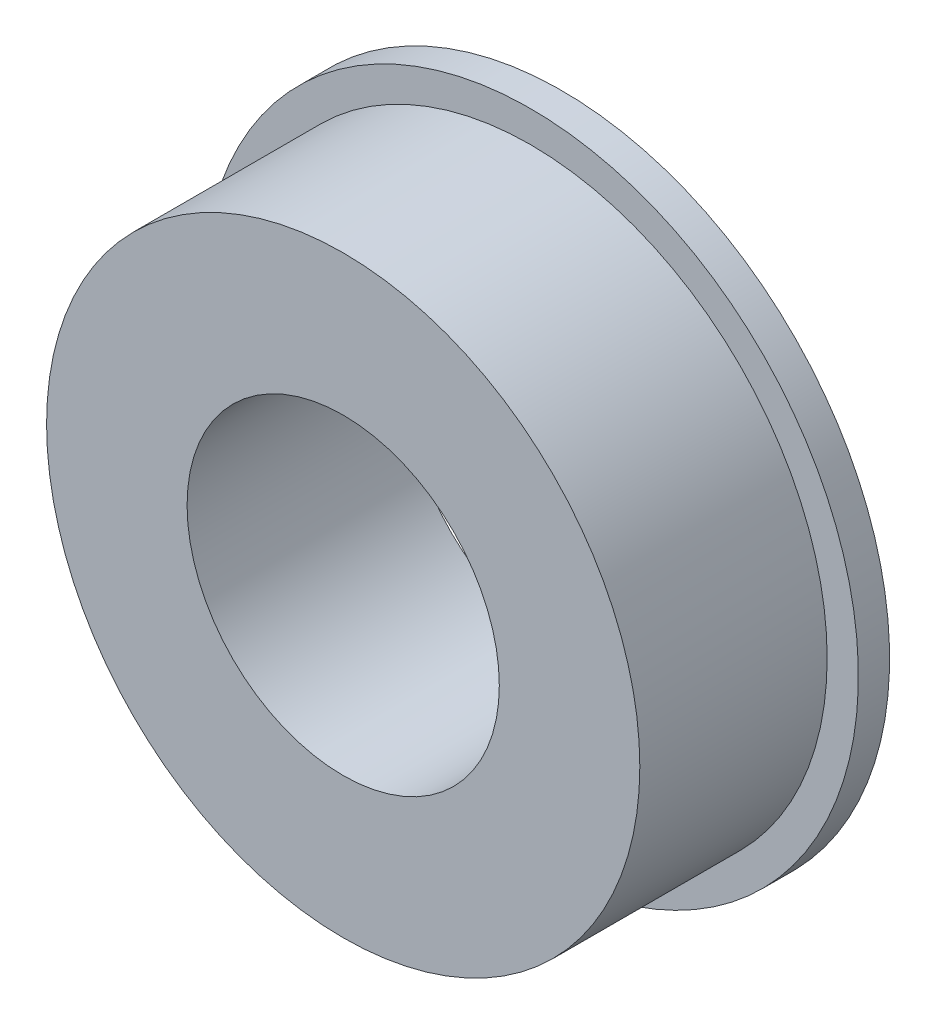
ISO-10303-21;
HEADER;
FILE_DESCRIPTION(('STEP AP214'),'2;1');
FILE_NAME('part.step','',(''),(''),'','','');
FILE_SCHEMA(('AUTOMOTIVE_DESIGN { 1 0 10303 214 1 1 1 1 }'));
ENDSEC;
DATA;
#1=APPLICATION_CONTEXT('core data for automotive mechanical design processes');
#2=APPLICATION_PROTOCOL_DEFINITION('international standard','automotive_design',2000,#1);
#3=PRODUCT_CONTEXT('',#1,'mechanical');
#4=PRODUCT('Part','Part','',(#3));
#5=PRODUCT_RELATED_PRODUCT_CATEGORY('part','',(#4));
#6=PRODUCT_DEFINITION_FORMATION('','',#4);
#7=PRODUCT_DEFINITION_CONTEXT('part definition',#1,'design');
#8=PRODUCT_DEFINITION('design','',#6,#7);
#9=PRODUCT_DEFINITION_SHAPE('','',#8);
#10=(LENGTH_UNIT() NAMED_UNIT(*) SI_UNIT(.MILLI.,.METRE.));
#11=(NAMED_UNIT(*) PLANE_ANGLE_UNIT() SI_UNIT($,.RADIAN.));
#12=(NAMED_UNIT(*) SI_UNIT($,.STERADIAN.) SOLID_ANGLE_UNIT());
#13=UNCERTAINTY_MEASURE_WITH_UNIT(LENGTH_MEASURE(1.E-05),#10,'distance_accuracy_value','');
#14=(GEOMETRIC_REPRESENTATION_CONTEXT(3) GLOBAL_UNCERTAINTY_ASSIGNED_CONTEXT((#13)) GLOBAL_UNIT_ASSIGNED_CONTEXT((#10,
#11,#12)) REPRESENTATION_CONTEXT('',''));
#15=CARTESIAN_POINT('',(0.,0.,0.));
#16=DIRECTION('',(0.,0.,1.));
#17=DIRECTION('',(1.,0.,0.));
#18=AXIS2_PLACEMENT_3D('',#15,#16,#17);
#19=CARTESIAN_POINT('',(0.,0.,6.));
#20=DIRECTION('',(0.,0.,1.));
#21=DIRECTION('',(1.,0.,0.));
#22=AXIS2_PLACEMENT_3D('',#19,#20,#21);
#23=PLANE('',#22);
#24=CARTESIAN_POINT('',(0.,0.,6.));
#25=DIRECTION('',(0.,0.,1.));
#26=DIRECTION('',(1.,0.,0.));
#27=AXIS2_PLACEMENT_3D('',#24,#25,#26);
#28=CIRCLE('',#27,9.5);
#29=CARTESIAN_POINT('',(9.5,0.,6.));
#30=VERTEX_POINT('',#29);
#31=EDGE_CURVE('E10',#30,#30,#28,.T.);
#32=ORIENTED_EDGE('',*,*,#31,.T.);
#33=EDGE_LOOP('',(#32));
#34=FACE_BOUND('',#33,.T.);
#35=CARTESIAN_POINT('',(0.,0.,6.));
#36=DIRECTION('',(0.,0.,1.));
#37=DIRECTION('',(1.,0.,0.));
#38=AXIS2_PLACEMENT_3D('',#35,#36,#37);
#39=CIRCLE('',#38,5.);
#40=CARTESIAN_POINT('',(5.,0.,6.));
#41=VERTEX_POINT('',#40);
#42=EDGE_CURVE('E45',#41,#41,#39,.T.);
#43=ORIENTED_EDGE('',*,*,#42,.F.);
#44=EDGE_LOOP('',(#43));
#45=FACE_BOUND('',#44,.T.);
#46=ADVANCED_FACE('F37',(#34,#45),#23,.T.);
#47=CARTESIAN_POINT('',(0.,0.,6.));
#48=DIRECTION('',(0.,0.,-1.));
#49=DIRECTION('',(-1.,0.,0.));
#50=AXIS2_PLACEMENT_3D('',#47,#48,#49);
#51=CYLINDRICAL_SURFACE('',#50,9.5);
#52=ORIENTED_EDGE('',*,*,#31,.F.);
#53=EDGE_LOOP('',(#52));
#54=FACE_BOUND('',#53,.T.);
#55=CARTESIAN_POINT('',(0.,0.,0.));
#56=DIRECTION('',(0.,0.,1.));
#57=DIRECTION('',(1.,0.,0.));
#58=AXIS2_PLACEMENT_3D('',#55,#56,#57);
#59=CIRCLE('',#58,9.5);
#60=CARTESIAN_POINT('',(9.5,0.,0.));
#61=VERTEX_POINT('',#60);
#62=EDGE_CURVE('E41',#61,#61,#59,.T.);
#63=ORIENTED_EDGE('',*,*,#62,.T.);
#64=EDGE_LOOP('',(#63));
#65=FACE_BOUND('',#64,.T.);
#66=ADVANCED_FACE('F39',(#54,#65),#51,.T.);
#67=CARTESIAN_POINT('',(0.,0.,6.));
#68=DIRECTION('',(0.,0.,-1.));
#69=DIRECTION('',(-1.,0.,0.));
#70=AXIS2_PLACEMENT_3D('',#67,#68,#69);
#71=CYLINDRICAL_SURFACE('',#70,5.);
#72=ORIENTED_EDGE('',*,*,#42,.T.);
#73=EDGE_LOOP('',(#72));
#74=FACE_BOUND('',#73,.T.);
#75=CARTESIAN_POINT('',(0.,0.,-1.));
#76=DIRECTION('',(0.,0.,-1.));
#77=DIRECTION('',(-1.,0.,0.));
#78=AXIS2_PLACEMENT_3D('',#75,#76,#77);
#79=CIRCLE('',#78,5.);
#80=CARTESIAN_POINT('',(-5.,0.,-1.));
#81=VERTEX_POINT('',#80);
#82=EDGE_CURVE('E55',#81,#81,#79,.T.);
#83=ORIENTED_EDGE('',*,*,#82,.T.);
#84=EDGE_LOOP('',(#83));
#85=FACE_BOUND('',#84,.T.);
#86=ADVANCED_FACE('F61',(#74,#85),#71,.F.);
#87=CARTESIAN_POINT('',(0.,0.,-1.));
#88=DIRECTION('',(0.,0.,-1.));
#89=DIRECTION('',(-1.,0.,0.));
#90=AXIS2_PLACEMENT_3D('',#87,#88,#89);
#91=PLANE('',#90);
#92=CARTESIAN_POINT('',(0.,0.,-1.));
#93=DIRECTION('',(0.,0.,-1.));
#94=DIRECTION('',(-1.,0.,0.));
#95=AXIS2_PLACEMENT_3D('',#92,#93,#94);
#96=CIRCLE('',#95,10.5);
#97=CARTESIAN_POINT('',(-10.5,0.,-1.));
#98=VERTEX_POINT('',#97);
#99=EDGE_CURVE('E54',#98,#98,#96,.T.);
#100=ORIENTED_EDGE('',*,*,#99,.T.);
#101=EDGE_LOOP('',(#100));
#102=FACE_BOUND('',#101,.T.);
#103=ORIENTED_EDGE('',*,*,#82,.F.);
#104=EDGE_LOOP('',(#103));
#105=FACE_BOUND('',#104,.T.);
#106=ADVANCED_FACE('F63',(#102,#105),#91,.T.);
#107=CARTESIAN_POINT('',(0.,0.,0.));
#108=DIRECTION('',(0.,0.,-1.));
#109=DIRECTION('',(-1.,0.,0.));
#110=AXIS2_PLACEMENT_3D('',#107,#108,#109);
#111=PLANE('',#110);
#112=ORIENTED_EDGE('',*,*,#62,.F.);
#113=EDGE_LOOP('',(#112));
#114=FACE_BOUND('',#113,.T.);
#115=CARTESIAN_POINT('',(0.,0.,0.));
#116=DIRECTION('',(0.,0.,-1.));
#117=DIRECTION('',(-1.,0.,0.));
#118=AXIS2_PLACEMENT_3D('',#115,#116,#117);
#119=CIRCLE('',#118,10.5);
#120=CARTESIAN_POINT('',(-10.5,0.,0.));
#121=VERTEX_POINT('',#120);
#122=EDGE_CURVE('E51',#121,#121,#119,.T.);
#123=ORIENTED_EDGE('',*,*,#122,.F.);
#124=EDGE_LOOP('',(#123));
#125=FACE_BOUND('',#124,.T.);
#126=ADVANCED_FACE('F65',(#114,#125),#111,.F.);
#127=CARTESIAN_POINT('',(0.,0.,-1.));
#128=DIRECTION('',(0.,0.,1.));
#129=DIRECTION('',(1.,0.,0.));
#130=AXIS2_PLACEMENT_3D('',#127,#128,#129);
#131=CYLINDRICAL_SURFACE('',#130,10.5);
#132=ORIENTED_EDGE('',*,*,#99,.F.);
#133=EDGE_LOOP('',(#132));
#134=FACE_BOUND('',#133,.T.);
#135=ORIENTED_EDGE('',*,*,#122,.T.);
#136=EDGE_LOOP('',(#135));
#137=FACE_BOUND('',#136,.T.);
#138=ADVANCED_FACE('F72',(#134,#137),#131,.T.);
#139=CLOSED_SHELL('',(#46,#66,#86,#106,#126,#138));
#140=MANIFOLD_SOLID_BREP('B2',#139);
#141=ADVANCED_BREP_SHAPE_REPRESENTATION('',(#18,#140),#14);
#142=SHAPE_DEFINITION_REPRESENTATION(#9,#141);
ENDSEC;
END-ISO-10303-21;
